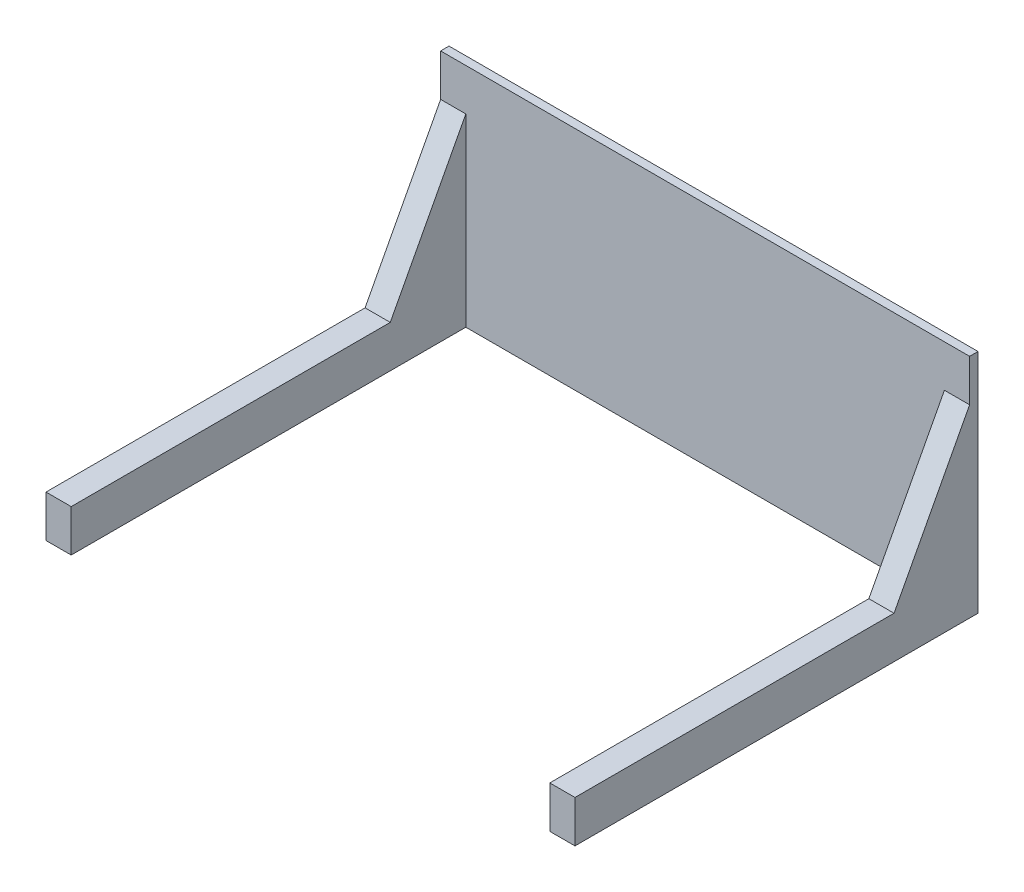
ISO-10303-21;
HEADER;
FILE_DESCRIPTION(('STEP AP214'),'2;1');
FILE_NAME('part.step','',(''),(''),'','','');
FILE_SCHEMA(('AUTOMOTIVE_DESIGN { 1 0 10303 214 1 1 1 1 }'));
ENDSEC;
DATA;
#1=APPLICATION_CONTEXT('core data for automotive mechanical design processes');
#2=APPLICATION_PROTOCOL_DEFINITION('international standard','automotive_design',2000,#1);
#3=PRODUCT_CONTEXT('',#1,'mechanical');
#4=PRODUCT('Part','Part','',(#3));
#5=PRODUCT_RELATED_PRODUCT_CATEGORY('part','',(#4));
#6=PRODUCT_DEFINITION_FORMATION('','',#4);
#7=PRODUCT_DEFINITION_CONTEXT('part definition',#1,'design');
#8=PRODUCT_DEFINITION('design','',#6,#7);
#9=PRODUCT_DEFINITION_SHAPE('','',#8);
#10=(LENGTH_UNIT() NAMED_UNIT(*) SI_UNIT(.MILLI.,.METRE.));
#11=(NAMED_UNIT(*) PLANE_ANGLE_UNIT() SI_UNIT($,.RADIAN.));
#12=(NAMED_UNIT(*) SI_UNIT($,.STERADIAN.) SOLID_ANGLE_UNIT());
#13=UNCERTAINTY_MEASURE_WITH_UNIT(LENGTH_MEASURE(1.E-05),#10,'distance_accuracy_value','');
#14=(GEOMETRIC_REPRESENTATION_CONTEXT(3) GLOBAL_UNCERTAINTY_ASSIGNED_CONTEXT((#13)) GLOBAL_UNIT_ASSIGNED_CONTEXT((#10,
#11,#12)) REPRESENTATION_CONTEXT('',''));
#15=CARTESIAN_POINT('',(0.,0.,0.));
#16=DIRECTION('',(0.,0.,1.));
#17=DIRECTION('',(1.,0.,0.));
#18=AXIS2_PLACEMENT_3D('',#15,#16,#17);
#19=CARTESIAN_POINT('',(-157.5,1190.,-1236.));
#20=DIRECTION('',(0.,1.,0.));
#21=DIRECTION('',(-1.,0.,0.));
#22=AXIS2_PLACEMENT_3D('',#19,#20,#21);
#23=PLANE('',#22);
#24=DIRECTION('',(0.,0.,-1.));
#25=VECTOR('',#24,1.);
#26=CARTESIAN_POINT('',(-142.5,1190.,-1226.));
#27=LINE('',#26,#25);
#28=CARTESIAN_POINT('',(-142.5,1190.,-1236.));
#29=VERTEX_POINT('',#28);
#30=CARTESIAN_POINT('',(-142.5,1190.,-1471.));
#31=VERTEX_POINT('',#30);
#32=EDGE_CURVE('E119',#29,#31,#27,.T.);
#33=ORIENTED_EDGE('',*,*,#32,.F.);
#34=DIRECTION('',(1.,0.,0.));
#35=VECTOR('',#34,1.);
#36=CARTESIAN_POINT('',(-157.5,1190.,-1236.));
#37=LINE('',#36,#35);
#38=CARTESIAN_POINT('',(-157.5,1190.,-1236.));
#39=VERTEX_POINT('',#38);
#40=EDGE_CURVE('E180',#39,#29,#37,.T.);
#41=ORIENTED_EDGE('',*,*,#40,.F.);
#42=DIRECTION('',(0.,0.,-1.));
#43=VECTOR('',#42,1.);
#44=CARTESIAN_POINT('',(-157.5,1190.,-1236.));
#45=LINE('',#44,#43);
#46=CARTESIAN_POINT('',(-157.5,1190.,-1476.));
#47=VERTEX_POINT('',#46);
#48=EDGE_CURVE('E194',#39,#47,#45,.T.);
#49=ORIENTED_EDGE('',*,*,#48,.T.);
#50=DIRECTION('',(1.,0.,0.));
#51=VECTOR('',#50,1.);
#52=CARTESIAN_POINT('',(-157.5,1190.,-1476.));
#53=LINE('',#52,#51);
#54=CARTESIAN_POINT('',(157.5,1190.,-1476.));
#55=VERTEX_POINT('',#54);
#56=EDGE_CURVE('E169',#47,#55,#53,.T.);
#57=ORIENTED_EDGE('',*,*,#56,.T.);
#58=DIRECTION('',(0.,0.,-1.));
#59=VECTOR('',#58,1.);
#60=CARTESIAN_POINT('',(157.5,1190.,-1236.));
#61=LINE('',#60,#59);
#62=CARTESIAN_POINT('',(157.5,1190.,-1236.));
#63=VERTEX_POINT('',#62);
#64=EDGE_CURVE('E191',#63,#55,#61,.T.);
#65=ORIENTED_EDGE('',*,*,#64,.F.);
#66=CARTESIAN_POINT('',(142.5,1190.,-1236.));
#67=VERTEX_POINT('',#66);
#68=EDGE_CURVE('E183',#67,#63,#37,.T.);
#69=ORIENTED_EDGE('',*,*,#68,.F.);
#70=DIRECTION('',(0.,0.,1.));
#71=VECTOR('',#70,1.);
#72=CARTESIAN_POINT('',(142.5,1190.,-1471.));
#73=LINE('',#72,#71);
#74=CARTESIAN_POINT('',(142.5,1190.,-1471.));
#75=VERTEX_POINT('',#74);
#76=EDGE_CURVE('E129',#75,#67,#73,.T.);
#77=ORIENTED_EDGE('',*,*,#76,.F.);
#78=DIRECTION('',(1.,0.,0.));
#79=VECTOR('',#78,1.);
#80=CARTESIAN_POINT('',(-142.5,1190.,-1471.));
#81=LINE('',#80,#79);
#82=EDGE_CURVE('E113',#31,#75,#81,.T.);
#83=ORIENTED_EDGE('',*,*,#82,.F.);
#84=EDGE_LOOP('',(#33,#41,#49,#57,#65,#69,#77,#83));
#85=FACE_BOUND('',#84,.T.);
#86=ADVANCED_FACE('F17',(#85),#23,.F.);
#87=CARTESIAN_POINT('',(-157.5,1190.,-1236.));
#88=DIRECTION('',(0.,0.,1.));
#89=DIRECTION('',(0.,-1.,0.));
#90=AXIS2_PLACEMENT_3D('',#87,#88,#89);
#91=PLANE('',#90);
#92=DIRECTION('',(0.,-1.,0.));
#93=VECTOR('',#92,1.);
#94=CARTESIAN_POINT('',(-142.5,1190.,-1236.));
#95=LINE('',#94,#93);
#96=CARTESIAN_POINT('',(-142.5,1215.,-1236.));
#97=VERTEX_POINT('',#96);
#98=EDGE_CURVE('E123',#97,#29,#95,.T.);
#99=ORIENTED_EDGE('',*,*,#98,.F.);
#100=DIRECTION('',(-1.,0.,0.));
#101=VECTOR('',#100,1.);
#102=CARTESIAN_POINT('',(157.5,1215.,-1236.));
#103=LINE('',#102,#101);
#104=CARTESIAN_POINT('',(-157.5,1215.,-1236.));
#105=VERTEX_POINT('',#104);
#106=EDGE_CURVE('E40',#97,#105,#103,.T.);
#107=ORIENTED_EDGE('',*,*,#106,.T.);
#108=DIRECTION('',(0.,-1.,0.));
#109=VECTOR('',#108,1.);
#110=CARTESIAN_POINT('',(-157.5,1325.,-1236.));
#111=LINE('',#110,#109);
#112=EDGE_CURVE('E177',#105,#39,#111,.T.);
#113=ORIENTED_EDGE('',*,*,#112,.T.);
#114=ORIENTED_EDGE('',*,*,#40,.T.);
#115=EDGE_LOOP('',(#99,#107,#113,#114));
#116=FACE_BOUND('',#115,.T.);
#117=ADVANCED_FACE('F229',(#116),#91,.T.);
#118=CARTESIAN_POINT('',(157.5,1300.,-1471.));
#119=DIRECTION('',(0.,-0.467887720419032,-0.883787916347062));
#120=DIRECTION('',(0.,0.883787916347062,-0.467887720419032));
#121=AXIS2_PLACEMENT_3D('',#118,#119,#120);
#122=PLANE('',#121);
#123=DIRECTION('',(-1.,0.,0.));
#124=VECTOR('',#123,1.);
#125=CARTESIAN_POINT('',(157.5,1215.,-1426.));
#126=LINE('',#125,#124);
#127=CARTESIAN_POINT('',(-142.5,1215.,-1426.));
#128=VERTEX_POINT('',#127);
#129=CARTESIAN_POINT('',(-157.5,1215.,-1426.));
#130=VERTEX_POINT('',#129);
#131=EDGE_CURVE('E161',#128,#130,#126,.T.);
#132=ORIENTED_EDGE('',*,*,#131,.F.);
#133=DIRECTION('',(0.,0.883787916347062,-0.467887720419032));
#134=VECTOR('',#133,1.);
#135=CARTESIAN_POINT('',(-142.5,1300.,-1471.));
#136=LINE('',#135,#134);
#137=CARTESIAN_POINT('',(-142.5,1300.,-1471.));
#138=VERTEX_POINT('',#137);
#139=EDGE_CURVE('E139',#128,#138,#136,.T.);
#140=ORIENTED_EDGE('',*,*,#139,.T.);
#141=DIRECTION('',(-1.,0.,0.));
#142=VECTOR('',#141,1.);
#143=CARTESIAN_POINT('',(157.5,1300.,-1471.));
#144=LINE('',#143,#142);
#145=CARTESIAN_POINT('',(-157.5,1300.,-1471.));
#146=VERTEX_POINT('',#145);
#147=EDGE_CURVE('E116',#138,#146,#144,.T.);
#148=ORIENTED_EDGE('',*,*,#147,.T.);
#149=DIRECTION('',(0.,-0.883787916347062,0.467887720419032));
#150=VECTOR('',#149,1.);
#151=CARTESIAN_POINT('',(-157.5,1300.,-1471.));
#152=LINE('',#151,#150);
#153=EDGE_CURVE('E144',#146,#130,#152,.T.);
#154=ORIENTED_EDGE('',*,*,#153,.T.);
#155=EDGE_LOOP('',(#132,#140,#148,#154));
#156=FACE_BOUND('',#155,.T.);
#157=ADVANCED_FACE('F226',(#156),#122,.F.);
#158=CARTESIAN_POINT('',(157.5,1215.,-1426.));
#159=DIRECTION('',(0.,-1.,0.));
#160=DIRECTION('',(0.,0.,-1.));
#161=AXIS2_PLACEMENT_3D('',#158,#159,#160);
#162=PLANE('',#161);
#163=ORIENTED_EDGE('',*,*,#106,.F.);
#164=DIRECTION('',(0.,0.,-1.));
#165=VECTOR('',#164,1.);
#166=CARTESIAN_POINT('',(-142.5,1215.,-1426.));
#167=LINE('',#166,#165);
#168=EDGE_CURVE('E11',#97,#128,#167,.T.);
#169=ORIENTED_EDGE('',*,*,#168,.T.);
#170=ORIENTED_EDGE('',*,*,#131,.T.);
#171=DIRECTION('',(0.,0.,1.));
#172=VECTOR('',#171,1.);
#173=CARTESIAN_POINT('',(-157.5,1215.,-1426.));
#174=LINE('',#173,#172);
#175=EDGE_CURVE('E147',#130,#105,#174,.T.);
#176=ORIENTED_EDGE('',*,*,#175,.T.);
#177=EDGE_LOOP('',(#163,#169,#170,#176));
#178=FACE_BOUND('',#177,.T.);
#179=ADVANCED_FACE('F228',(#178),#162,.F.);
#180=CARTESIAN_POINT('',(-157.5,1325.,-1236.));
#181=DIRECTION('',(1.,0.,0.));
#182=DIRECTION('',(0.,1.,0.));
#183=AXIS2_PLACEMENT_3D('',#180,#181,#182);
#184=PLANE('',#183);
#185=DIRECTION('',(0.,-1.,0.));
#186=VECTOR('',#185,1.);
#187=CARTESIAN_POINT('',(-157.5,1350.,-1471.));
#188=LINE('',#187,#186);
#189=CARTESIAN_POINT('',(-157.5,1325.,-1471.));
#190=VERTEX_POINT('',#189);
#191=EDGE_CURVE('E142',#190,#146,#188,.T.);
#192=ORIENTED_EDGE('',*,*,#191,.F.);
#193=DIRECTION('',(0.,0.,-1.));
#194=VECTOR('',#193,1.);
#195=CARTESIAN_POINT('',(-157.5,1325.,-1236.));
#196=LINE('',#195,#194);
#197=CARTESIAN_POINT('',(-157.5,1325.,-1476.));
#198=VERTEX_POINT('',#197);
#199=EDGE_CURVE('E186',#190,#198,#196,.T.);
#200=ORIENTED_EDGE('',*,*,#199,.T.);
#201=DIRECTION('',(0.,-1.,0.));
#202=VECTOR('',#201,1.);
#203=CARTESIAN_POINT('',(-157.5,1325.,-1476.));
#204=LINE('',#203,#202);
#205=EDGE_CURVE('E168',#198,#47,#204,.T.);
#206=ORIENTED_EDGE('',*,*,#205,.T.);
#207=ORIENTED_EDGE('',*,*,#48,.F.);
#208=ORIENTED_EDGE('',*,*,#112,.F.);
#209=ORIENTED_EDGE('',*,*,#175,.F.);
#210=ORIENTED_EDGE('',*,*,#153,.F.);
#211=EDGE_LOOP('',(#192,#200,#206,#207,#208,#209,#210));
#212=FACE_BOUND('',#211,.T.);
#213=ADVANCED_FACE('F19',(#212),#184,.F.);
#214=CARTESIAN_POINT('',(157.5,1190.,-1236.));
#215=DIRECTION('',(-1.,0.,0.));
#216=DIRECTION('',(0.,-1.,0.));
#217=AXIS2_PLACEMENT_3D('',#214,#215,#216);
#218=PLANE('',#217);
#219=DIRECTION('',(0.,-0.883787916347062,0.467887720419032));
#220=VECTOR('',#219,1.);
#221=CARTESIAN_POINT('',(157.5,1300.,-1471.));
#222=LINE('',#221,#220);
#223=CARTESIAN_POINT('',(157.5,1300.,-1471.));
#224=VERTEX_POINT('',#223);
#225=CARTESIAN_POINT('',(157.5,1215.,-1426.));
#226=VERTEX_POINT('',#225);
#227=EDGE_CURVE('E152',#224,#226,#222,.T.);
#228=ORIENTED_EDGE('',*,*,#227,.T.);
#229=DIRECTION('',(0.,0.,1.));
#230=VECTOR('',#229,1.);
#231=CARTESIAN_POINT('',(157.5,1215.,-1426.));
#232=LINE('',#231,#230);
#233=CARTESIAN_POINT('',(157.5,1215.,-1236.));
#234=VERTEX_POINT('',#233);
#235=EDGE_CURVE('E155',#226,#234,#232,.T.);
#236=ORIENTED_EDGE('',*,*,#235,.T.);
#237=DIRECTION('',(0.,1.,0.));
#238=VECTOR('',#237,1.);
#239=CARTESIAN_POINT('',(157.5,1190.,-1236.));
#240=LINE('',#239,#238);
#241=EDGE_CURVE('E182',#63,#234,#240,.T.);
#242=ORIENTED_EDGE('',*,*,#241,.F.);
#243=ORIENTED_EDGE('',*,*,#64,.T.);
#244=DIRECTION('',(0.,1.,0.));
#245=VECTOR('',#244,1.);
#246=CARTESIAN_POINT('',(157.5,1190.,-1476.));
#247=LINE('',#246,#245);
#248=CARTESIAN_POINT('',(157.5,1325.,-1476.));
#249=VERTEX_POINT('',#248);
#250=EDGE_CURVE('E171',#55,#249,#247,.T.);
#251=ORIENTED_EDGE('',*,*,#250,.T.);
#252=DIRECTION('',(0.,0.,-1.));
#253=VECTOR('',#252,1.);
#254=CARTESIAN_POINT('',(157.5,1325.,-1236.));
#255=LINE('',#254,#253);
#256=CARTESIAN_POINT('',(157.5,1325.,-1471.));
#257=VERTEX_POINT('',#256);
#258=EDGE_CURVE('E189',#257,#249,#255,.T.);
#259=ORIENTED_EDGE('',*,*,#258,.F.);
#260=DIRECTION('',(0.,-1.,0.));
#261=VECTOR('',#260,1.);
#262=CARTESIAN_POINT('',(157.5,1350.,-1471.));
#263=LINE('',#262,#261);
#264=EDGE_CURVE('E149',#257,#224,#263,.T.);
#265=ORIENTED_EDGE('',*,*,#264,.T.);
#266=EDGE_LOOP('',(#228,#236,#242,#243,#251,#259,#265));
#267=FACE_BOUND('',#266,.T.);
#268=ADVANCED_FACE('F206',(#267),#218,.F.);
#269=CARTESIAN_POINT('',(157.5,1325.,-1236.));
#270=DIRECTION('',(0.,-1.,0.));
#271=DIRECTION('',(1.,0.,0.));
#272=AXIS2_PLACEMENT_3D('',#269,#270,#271);
#273=PLANE('',#272);
#274=ORIENTED_EDGE('',*,*,#199,.F.);
#275=DIRECTION('',(1.,0.,0.));
#276=VECTOR('',#275,1.);
#277=CARTESIAN_POINT('',(157.5,1325.,-1471.));
#278=LINE('',#277,#276);
#279=EDGE_CURVE('E197',#190,#257,#278,.T.);
#280=ORIENTED_EDGE('',*,*,#279,.T.);
#281=ORIENTED_EDGE('',*,*,#258,.T.);
#282=DIRECTION('',(-1.,0.,0.));
#283=VECTOR('',#282,1.);
#284=CARTESIAN_POINT('',(157.5,1325.,-1476.));
#285=LINE('',#284,#283);
#286=EDGE_CURVE('E174',#249,#198,#285,.T.);
#287=ORIENTED_EDGE('',*,*,#286,.T.);
#288=EDGE_LOOP('',(#274,#280,#281,#287));
#289=FACE_BOUND('',#288,.T.);
#290=ADVANCED_FACE('F217',(#289),#273,.F.);
#291=DIRECTION('',(0.,1.,0.));
#292=VECTOR('',#291,1.);
#293=CARTESIAN_POINT('',(142.5,1190.,-1236.));
#294=LINE('',#293,#292);
#295=CARTESIAN_POINT('',(142.5,1215.,-1236.));
#296=VERTEX_POINT('',#295);
#297=EDGE_CURVE('E32',#67,#296,#294,.T.);
#298=ORIENTED_EDGE('',*,*,#297,.F.);
#299=ORIENTED_EDGE('',*,*,#68,.T.);
#300=ORIENTED_EDGE('',*,*,#241,.T.);
#301=EDGE_CURVE('E158',#234,#296,#103,.T.);
#302=ORIENTED_EDGE('',*,*,#301,.T.);
#303=EDGE_LOOP('',(#298,#299,#300,#302));
#304=FACE_BOUND('',#303,.T.);
#305=ADVANCED_FACE('F202',(#304),#91,.T.);
#306=CARTESIAN_POINT('',(-157.5,1190.,-1476.));
#307=DIRECTION('',(0.,0.,1.));
#308=DIRECTION('',(0.,-1.,0.));
#309=AXIS2_PLACEMENT_3D('',#306,#307,#308);
#310=PLANE('',#309);
#311=ORIENTED_EDGE('',*,*,#205,.F.);
#312=ORIENTED_EDGE('',*,*,#286,.F.);
#313=ORIENTED_EDGE('',*,*,#250,.F.);
#314=ORIENTED_EDGE('',*,*,#56,.F.);
#315=EDGE_LOOP('',(#311,#312,#313,#314));
#316=FACE_BOUND('',#315,.T.);
#317=ADVANCED_FACE('F231',(#316),#310,.F.);
#318=CARTESIAN_POINT('',(157.5,1350.,-1471.));
#319=DIRECTION('',(0.,0.,-1.));
#320=DIRECTION('',(0.,1.,0.));
#321=AXIS2_PLACEMENT_3D('',#318,#319,#320);
#322=PLANE('',#321);
#323=ORIENTED_EDGE('',*,*,#264,.F.);
#324=ORIENTED_EDGE('',*,*,#279,.F.);
#325=ORIENTED_EDGE('',*,*,#191,.T.);
#326=ORIENTED_EDGE('',*,*,#147,.F.);
#327=DIRECTION('',(0.,-1.,0.));
#328=VECTOR('',#327,1.);
#329=CARTESIAN_POINT('',(-142.5,1390.,-1471.));
#330=LINE('',#329,#328);
#331=EDGE_CURVE('E107',#138,#31,#330,.T.);
#332=ORIENTED_EDGE('',*,*,#331,.T.);
#333=ORIENTED_EDGE('',*,*,#82,.T.);
#334=DIRECTION('',(0.,-1.,0.));
#335=VECTOR('',#334,1.);
#336=CARTESIAN_POINT('',(142.5,1390.,-1471.));
#337=LINE('',#336,#335);
#338=CARTESIAN_POINT('',(142.5,1300.,-1471.));
#339=VERTEX_POINT('',#338);
#340=EDGE_CURVE('E130',#339,#75,#337,.T.);
#341=ORIENTED_EDGE('',*,*,#340,.F.);
#342=EDGE_CURVE('E165',#224,#339,#144,.T.);
#343=ORIENTED_EDGE('',*,*,#342,.F.);
#344=EDGE_LOOP('',(#323,#324,#325,#326,#332,#333,#341,#343));
#345=FACE_BOUND('',#344,.T.);
#346=ADVANCED_FACE('F110',(#345),#322,.F.);
#347=ORIENTED_EDGE('',*,*,#342,.T.);
#348=DIRECTION('',(0.,-0.883787916347062,0.467887720419032));
#349=VECTOR('',#348,1.);
#350=CARTESIAN_POINT('',(142.5,1300.,-1471.));
#351=LINE('',#350,#349);
#352=CARTESIAN_POINT('',(142.5,1215.,-1426.));
#353=VERTEX_POINT('',#352);
#354=EDGE_CURVE('E135',#339,#353,#351,.T.);
#355=ORIENTED_EDGE('',*,*,#354,.T.);
#356=EDGE_CURVE('E162',#226,#353,#126,.T.);
#357=ORIENTED_EDGE('',*,*,#356,.F.);
#358=ORIENTED_EDGE('',*,*,#227,.F.);
#359=EDGE_LOOP('',(#347,#355,#357,#358));
#360=FACE_BOUND('',#359,.T.);
#361=ADVANCED_FACE('F211',(#360),#122,.F.);
#362=ORIENTED_EDGE('',*,*,#356,.T.);
#363=DIRECTION('',(0.,0.,1.));
#364=VECTOR('',#363,1.);
#365=CARTESIAN_POINT('',(142.5,1215.,-1426.));
#366=LINE('',#365,#364);
#367=EDGE_CURVE('E25',#353,#296,#366,.T.);
#368=ORIENTED_EDGE('',*,*,#367,.T.);
#369=ORIENTED_EDGE('',*,*,#301,.F.);
#370=ORIENTED_EDGE('',*,*,#235,.F.);
#371=EDGE_LOOP('',(#362,#368,#369,#370));
#372=FACE_BOUND('',#371,.T.);
#373=ADVANCED_FACE('F199',(#372),#162,.F.);
#374=CARTESIAN_POINT('',(-142.5,1390.,-1226.));
#375=DIRECTION('',(-1.,0.,0.));
#376=DIRECTION('',(0.,0.,1.));
#377=AXIS2_PLACEMENT_3D('',#374,#375,#376);
#378=PLANE('',#377);
#379=ORIENTED_EDGE('',*,*,#168,.F.);
#380=ORIENTED_EDGE('',*,*,#98,.T.);
#381=ORIENTED_EDGE('',*,*,#32,.T.);
#382=ORIENTED_EDGE('',*,*,#331,.F.);
#383=ORIENTED_EDGE('',*,*,#139,.F.);
#384=EDGE_LOOP('',(#379,#380,#381,#382,#383));
#385=FACE_BOUND('',#384,.T.);
#386=ADVANCED_FACE('F122',(#385),#378,.F.);
#387=CARTESIAN_POINT('',(142.5,1390.,-1471.));
#388=DIRECTION('',(1.,0.,0.));
#389=DIRECTION('',(0.,0.,-1.));
#390=AXIS2_PLACEMENT_3D('',#387,#388,#389);
#391=PLANE('',#390);
#392=ORIENTED_EDGE('',*,*,#76,.T.);
#393=ORIENTED_EDGE('',*,*,#297,.T.);
#394=ORIENTED_EDGE('',*,*,#367,.F.);
#395=ORIENTED_EDGE('',*,*,#354,.F.);
#396=ORIENTED_EDGE('',*,*,#340,.T.);
#397=EDGE_LOOP('',(#392,#393,#394,#395,#396));
#398=FACE_BOUND('',#397,.T.);
#399=ADVANCED_FACE('F212',(#398),#391,.F.);
#400=CLOSED_SHELL('',(#86,#117,#157,#179,#213,#268,#290,#305,#317,#346,#361,#373,#386,#399));
#401=MANIFOLD_SOLID_BREP('B1',#400);
#402=ADVANCED_BREP_SHAPE_REPRESENTATION('',(#18,#401),#14);
#403=SHAPE_DEFINITION_REPRESENTATION(#9,#402);
ENDSEC;
END-ISO-10303-21;
